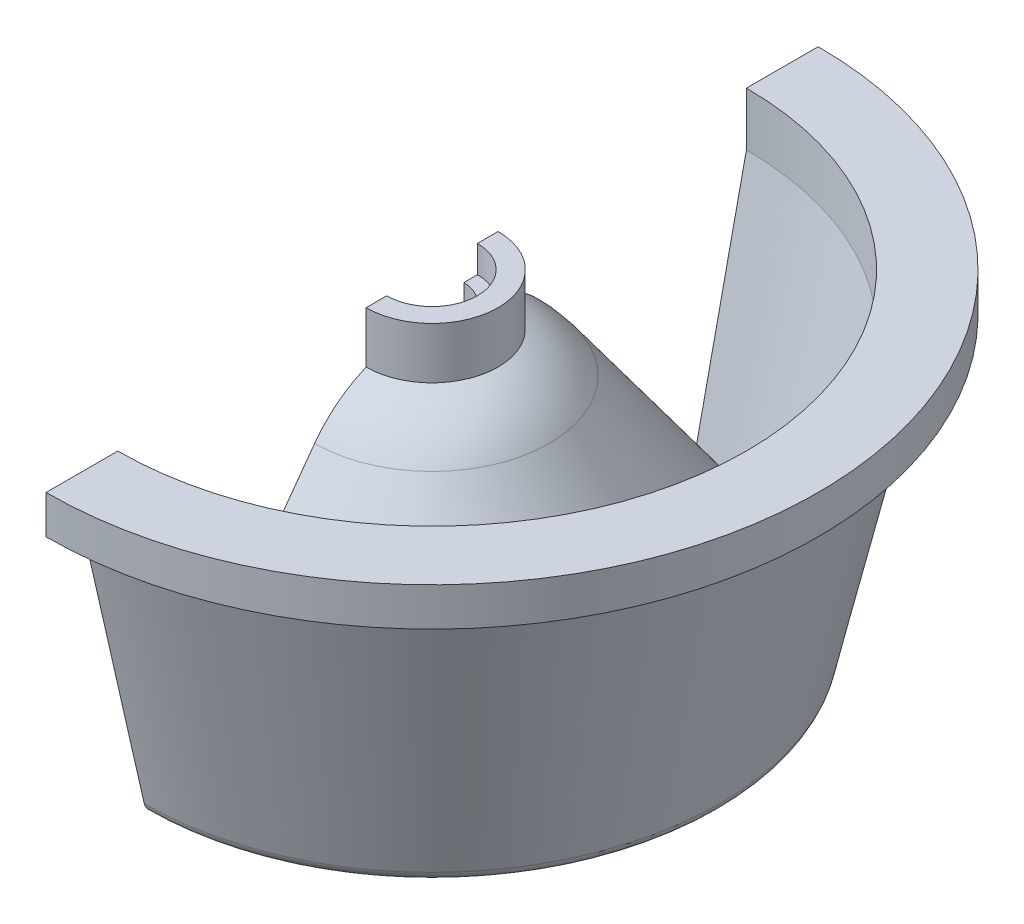
ISO-10303-21;
HEADER;
FILE_DESCRIPTION(('STEP AP214'),'2;1');
FILE_NAME('part.step','',(''),(''),'','','');
FILE_SCHEMA(('AUTOMOTIVE_DESIGN { 1 0 10303 214 1 1 1 1 }'));
ENDSEC;
DATA;
#1=APPLICATION_CONTEXT('core data for automotive mechanical design processes');
#2=APPLICATION_PROTOCOL_DEFINITION('international standard','automotive_design',2000,#1);
#3=PRODUCT_CONTEXT('',#1,'mechanical');
#4=PRODUCT('Part','Part','',(#3));
#5=PRODUCT_RELATED_PRODUCT_CATEGORY('part','',(#4));
#6=PRODUCT_DEFINITION_FORMATION('','',#4);
#7=PRODUCT_DEFINITION_CONTEXT('part definition',#1,'design');
#8=PRODUCT_DEFINITION('design','',#6,#7);
#9=PRODUCT_DEFINITION_SHAPE('','',#8);
#10=(LENGTH_UNIT() NAMED_UNIT(*) SI_UNIT(.MILLI.,.METRE.));
#11=(NAMED_UNIT(*) PLANE_ANGLE_UNIT() SI_UNIT($,.RADIAN.));
#12=(NAMED_UNIT(*) SI_UNIT($,.STERADIAN.) SOLID_ANGLE_UNIT());
#13=UNCERTAINTY_MEASURE_WITH_UNIT(LENGTH_MEASURE(1.E-05),#10,'distance_accuracy_value','');
#14=(GEOMETRIC_REPRESENTATION_CONTEXT(3) GLOBAL_UNCERTAINTY_ASSIGNED_CONTEXT((#13)) GLOBAL_UNIT_ASSIGNED_CONTEXT((#10,
#11,#12)) REPRESENTATION_CONTEXT('',''));
#15=CARTESIAN_POINT('',(0.,0.,0.));
#16=DIRECTION('',(0.,0.,1.));
#17=DIRECTION('',(1.,0.,0.));
#18=AXIS2_PLACEMENT_3D('',#15,#16,#17);
#19=CARTESIAN_POINT('',(0.,0.,0.));
#20=DIRECTION('',(1.,0.,0.));
#21=DIRECTION('',(0.,0.,-1.));
#22=AXIS2_PLACEMENT_3D('',#19,#20,#21);
#23=PLANE('',#22);
#24=DIRECTION('',(0.,0.,1.));
#25=VECTOR('',#24,1.);
#26=CARTESIAN_POINT('',(0.,42.5,-85.203979415));
#27=LINE('',#26,#25);
#28=CARTESIAN_POINT('',(0.,42.5,-14.564274866966));
#29=VERTEX_POINT('',#28);
#30=CARTESIAN_POINT('',(0.,42.5,-10.));
#31=VERTEX_POINT('',#30);
#32=EDGE_CURVE('E177',#29,#31,#27,.T.);
#33=ORIENTED_EDGE('',*,*,#32,.F.);
#34=DIRECTION('',(0.,1.,0.));
#35=VECTOR('',#34,1.);
#36=CARTESIAN_POINT('',(0.,0.,-14.564274866966));
#37=LINE('',#36,#35);
#38=CARTESIAN_POINT('',(0.,31.1469664993675,-14.564274866966));
#39=VERTEX_POINT('',#38);
#40=EDGE_CURVE('E189',#39,#29,#37,.T.);
#41=ORIENTED_EDGE('',*,*,#40,.F.);
#42=CARTESIAN_POINT('',(0.,6.67345768639848,-4.5333456199246));
#43=DIRECTION('',(1.,0.,0.));
#44=DIRECTION('',(0.,0.,-1.));
#45=AXIS2_PLACEMENT_3D('',#42,#43,#44);
#46=CIRCLE('',#45,26.4494267457279);
#47=CARTESIAN_POINT('',(0.,22.235882692982,-25.9198624726543));
#48=VERTEX_POINT('',#47);
#49=EDGE_CURVE('E282',#48,#39,#46,.T.);
#50=ORIENTED_EDGE('',*,*,#49,.F.);
#51=DIRECTION('',(0.,0.808581488677597,0.588384207952526));
#52=VECTOR('',#51,1.);
#53=CARTESIAN_POINT('',(0.,57.8560110057194,0.));
#54=LINE('',#53,#52);
#55=CARTESIAN_POINT('',(0.,-21.8366269513204,-57.9903081143829));
#56=VERTEX_POINT('',#55);
#57=EDGE_CURVE('E276',#56,#48,#54,.T.);
#58=ORIENTED_EDGE('',*,*,#57,.F.);
#59=DIRECTION('',(0.,0.977325455953386,-0.211742657831402));
#60=VECTOR('',#59,1.);
#61=CARTESIAN_POINT('',(0.,-289.498348492069,0.));
#62=LINE('',#61,#60);
#63=CARTESIAN_POINT('',(0.,30.6647699152248,-69.3650095965407));
#64=VERTEX_POINT('',#63);
#65=EDGE_CURVE('E260',#64,#56,#62,.F.);
#66=ORIENTED_EDGE('',*,*,#65,.F.);
#67=DIRECTION('',(0.,1.,0.));
#68=VECTOR('',#67,1.);
#69=CARTESIAN_POINT('',(0.,0.,-69.3650095965407));
#70=LINE('',#69,#68);
#71=CARTESIAN_POINT('',(0.,42.5,-69.3650095965407));
#72=VERTEX_POINT('',#71);
#73=EDGE_CURVE('E259',#72,#64,#70,.F.);
#74=ORIENTED_EDGE('',*,*,#73,.F.);
#75=DIRECTION('',(0.,0.,1.));
#76=VECTOR('',#75,1.);
#77=CARTESIAN_POINT('',(0.,42.5,-85.203979415));
#78=LINE('',#77,#76);
#79=CARTESIAN_POINT('',(0.,42.5,-85.203979415));
#80=VERTEX_POINT('',#79);
#81=EDGE_CURVE('E252',#80,#72,#78,.T.);
#82=ORIENTED_EDGE('',*,*,#81,.F.);
#83=DIRECTION('',(0.,1.,0.));
#84=VECTOR('',#83,1.);
#85=CARTESIAN_POINT('',(0.,42.5,-85.203979415));
#86=LINE('',#85,#84);
#87=CARTESIAN_POINT('',(0.,34.0219145176376,-85.203979415));
#88=VERTEX_POINT('',#87);
#89=EDGE_CURVE('E178',#88,#80,#86,.T.);
#90=ORIENTED_EDGE('',*,*,#89,.F.);
#91=DIRECTION('',(0.,0.,1.));
#92=VECTOR('',#91,1.);
#93=CARTESIAN_POINT('',(0.,34.0219145176376,0.));
#94=LINE('',#93,#92);
#95=CARTESIAN_POINT('',(0.,34.0219145176376,-81.203979415));
#96=VERTEX_POINT('',#95);
#97=EDGE_CURVE('E248',#88,#96,#94,.T.);
#98=ORIENTED_EDGE('',*,*,#97,.T.);
#99=DIRECTION('',(0.,1.,0.));
#100=VECTOR('',#99,1.);
#101=CARTESIAN_POINT('',(0.,0.,-81.203979415));
#102=LINE('',#101,#100);
#103=CARTESIAN_POINT('',(0.,36.5219145176376,-81.203979415));
#104=VERTEX_POINT('',#103);
#105=EDGE_CURVE('E41',#96,#104,#102,.T.);
#106=ORIENTED_EDGE('',*,*,#105,.T.);
#107=DIRECTION('',(0.,0.,1.));
#108=VECTOR('',#107,1.);
#109=CARTESIAN_POINT('',(0.,36.5219145176376,0.));
#110=LINE('',#109,#108);
#111=CARTESIAN_POINT('',(0.,36.5219145176376,-76.8418703494323));
#112=VERTEX_POINT('',#111);
#113=EDGE_CURVE('E49',#104,#112,#110,.T.);
#114=ORIENTED_EDGE('',*,*,#113,.T.);
#115=DIRECTION('',(0.,1.,0.));
#116=VECTOR('',#115,1.);
#117=CARTESIAN_POINT('',(0.,-1.22114086324986,-76.8418703494323));
#118=LINE('',#117,#116);
#119=CARTESIAN_POINT('',(0.,30.6647699152248,-76.8418703494323));
#120=VERTEX_POINT('',#119);
#121=EDGE_CURVE('E263',#120,#112,#118,.T.);
#122=ORIENTED_EDGE('',*,*,#121,.F.);
#123=DIRECTION('',(0.,0.975026435469395,-0.222088833883753));
#124=VECTOR('',#123,1.);
#125=CARTESIAN_POINT('',(0.,-306.690574031625,0.));
#126=LINE('',#125,#124);
#127=CARTESIAN_POINT('',(0.,-27.7913157893171,-63.5269042774811));
#128=VERTEX_POINT('',#127);
#129=EDGE_CURVE('E267',#128,#120,#126,.T.);
#130=ORIENTED_EDGE('',*,*,#129,.F.);
#131=CARTESIAN_POINT('',(0.,-27.1250492876658,-60.6018249710729));
#132=DIRECTION('',(1.,0.,0.));
#133=DIRECTION('',(0.,0.,-1.));
#134=AXIS2_PLACEMENT_3D('',#131,#132,#133);
#135=CIRCLE('',#134,3.00000000000001);
#136=CARTESIAN_POINT('',(0.,-28.8902019115234,-58.1760805050401));
#137=VERTEX_POINT('',#136);
#138=EDGE_CURVE('E251',#137,#128,#135,.T.);
#139=ORIENTED_EDGE('',*,*,#138,.F.);
#140=DIRECTION('',(0.,0.808581488677597,0.588384207952526));
#141=VECTOR('',#140,1.);
#142=CARTESIAN_POINT('',(0.,51.0577320139713,0.));
#143=LINE('',#142,#141);
#144=CARTESIAN_POINT('',(0.,19.8823458611719,-22.6855365179439));
#145=VERTEX_POINT('',#144);
#146=EDGE_CURVE('E274',#145,#137,#143,.F.);
#147=ORIENTED_EDGE('',*,*,#146,.F.);
#148=CARTESIAN_POINT('',(0.,6.67345768639848,-4.53334561992459));
#149=DIRECTION('',(1.,0.,0.));
#150=DIRECTION('',(0.,0.,-1.));
#151=AXIS2_PLACEMENT_3D('',#148,#149,#150);
#152=CIRCLE('',#151,22.4494267457279);
#153=CARTESIAN_POINT('',(0.,28.9869598180912,-7.00000000000001));
#154=VERTEX_POINT('',#153);
#155=EDGE_CURVE('E279',#154,#145,#152,.F.);
#156=ORIENTED_EDGE('',*,*,#155,.F.);
#157=DIRECTION('',(0.,1.,0.));
#158=VECTOR('',#157,1.);
#159=CARTESIAN_POINT('',(0.,-1.22114086324985,-7.));
#160=LINE('',#159,#158);
#161=CARTESIAN_POINT('',(0.,36.5219145176376,-7.00000000000001));
#162=VERTEX_POINT('',#161);
#163=EDGE_CURVE('E280',#162,#154,#160,.F.);
#164=ORIENTED_EDGE('',*,*,#163,.F.);
#165=DIRECTION('',(0.,0.,1.));
#166=VECTOR('',#165,1.);
#167=CARTESIAN_POINT('',(0.,36.5219145176376,0.));
#168=LINE('',#167,#166);
#169=CARTESIAN_POINT('',(0.,36.5219145176376,-10.));
#170=VERTEX_POINT('',#169);
#171=EDGE_CURVE('E284',#170,#162,#168,.T.);
#172=ORIENTED_EDGE('',*,*,#171,.F.);
#173=DIRECTION('',(0.,-1.,0.));
#174=VECTOR('',#173,1.);
#175=CARTESIAN_POINT('',(0.,46.5219145176376,-10.));
#176=LINE('',#175,#174);
#177=EDGE_CURVE('E36',#31,#170,#176,.T.);
#178=ORIENTED_EDGE('',*,*,#177,.F.);
#179=EDGE_LOOP('',(#33,#41,#50,#58,#66,#74,#82,#90,#98,#106,#114,#122,#130,#139,#147,#156,#164,
#172,#178));
#180=FACE_BOUND('',#179,.T.);
#181=ADVANCED_FACE('F33',(#180),#23,.F.);
#182=CARTESIAN_POINT('',(0.,36.5219145176376,7.00000000000001));
#183=VERTEX_POINT('',#182);
#184=CARTESIAN_POINT('',(0.,36.5219145176376,9.99999999999999));
#185=VERTEX_POINT('',#184);
#186=EDGE_CURVE('E286',#183,#185,#168,.T.);
#187=ORIENTED_EDGE('',*,*,#186,.F.);
#188=DIRECTION('',(0.,1.,0.));
#189=VECTOR('',#188,1.);
#190=CARTESIAN_POINT('',(0.,-1.22114086324985,7.00000000000001));
#191=LINE('',#190,#189);
#192=CARTESIAN_POINT('',(0.,28.9869598180912,7.));
#193=VERTEX_POINT('',#192);
#194=EDGE_CURVE('E283',#193,#183,#191,.T.);
#195=ORIENTED_EDGE('',*,*,#194,.F.);
#196=CARTESIAN_POINT('',(0.,6.67345768639848,4.5333456199246));
#197=DIRECTION('',(1.,0.,0.));
#198=DIRECTION('',(0.,0.,-1.));
#199=AXIS2_PLACEMENT_3D('',#196,#197,#198);
#200=CIRCLE('',#199,22.4494267457279);
#201=CARTESIAN_POINT('',(0.,19.8823458611719,22.6855365179439));
#202=VERTEX_POINT('',#201);
#203=EDGE_CURVE('E277',#202,#193,#200,.F.);
#204=ORIENTED_EDGE('',*,*,#203,.F.);
#205=DIRECTION('',(0.,-0.808581488677597,0.588384207952526));
#206=VECTOR('',#205,1.);
#207=CARTESIAN_POINT('',(0.,51.0577320139713,0.));
#208=LINE('',#207,#206);
#209=CARTESIAN_POINT('',(0.,-28.8902019115234,58.1760805050401));
#210=VERTEX_POINT('',#209);
#211=EDGE_CURVE('E264',#210,#202,#208,.F.);
#212=ORIENTED_EDGE('',*,*,#211,.F.);
#213=CARTESIAN_POINT('',(0.,-27.1250492876658,60.601824971073));
#214=DIRECTION('',(1.,0.,0.));
#215=DIRECTION('',(0.,0.,-1.));
#216=AXIS2_PLACEMENT_3D('',#213,#214,#215);
#217=CIRCLE('',#216,3.00000000000001);
#218=CARTESIAN_POINT('',(0.,-27.791315789317,63.5269042774812));
#219=VERTEX_POINT('',#218);
#220=EDGE_CURVE('E268',#219,#210,#217,.T.);
#221=ORIENTED_EDGE('',*,*,#220,.F.);
#222=DIRECTION('',(0.,-0.975026435469395,-0.222088833883753));
#223=VECTOR('',#222,1.);
#224=CARTESIAN_POINT('',(0.,-306.690574031625,0.));
#225=LINE('',#224,#223);
#226=CARTESIAN_POINT('',(0.,30.6647699152249,76.8418703494323));
#227=VERTEX_POINT('',#226);
#228=EDGE_CURVE('E265',#227,#219,#225,.T.);
#229=ORIENTED_EDGE('',*,*,#228,.F.);
#230=DIRECTION('',(0.,1.,0.));
#231=VECTOR('',#230,1.);
#232=CARTESIAN_POINT('',(0.,-1.22114086324983,76.8418703494323));
#233=LINE('',#232,#231);
#234=CARTESIAN_POINT('',(0.,36.5219145176376,76.8418703494323));
#235=VERTEX_POINT('',#234);
#236=EDGE_CURVE('E261',#235,#227,#233,.F.);
#237=ORIENTED_EDGE('',*,*,#236,.F.);
#238=CARTESIAN_POINT('',(0.,36.5219145176376,81.203979415));
#239=VERTEX_POINT('',#238);
#240=EDGE_CURVE('E255',#235,#239,#110,.T.);
#241=ORIENTED_EDGE('',*,*,#240,.T.);
#242=DIRECTION('',(0.,1.,0.));
#243=VECTOR('',#242,1.);
#244=CARTESIAN_POINT('',(0.,0.,81.203979415));
#245=LINE('',#244,#243);
#246=CARTESIAN_POINT('',(0.,34.0219145176376,81.203979415));
#247=VERTEX_POINT('',#246);
#248=EDGE_CURVE('E11',#239,#247,#245,.F.);
#249=ORIENTED_EDGE('',*,*,#248,.T.);
#250=CARTESIAN_POINT('',(0.,34.0219145176376,85.203979415));
#251=VERTEX_POINT('',#250);
#252=EDGE_CURVE('E245',#247,#251,#94,.T.);
#253=ORIENTED_EDGE('',*,*,#252,.T.);
#254=DIRECTION('',(0.,1.,0.));
#255=VECTOR('',#254,1.);
#256=CARTESIAN_POINT('',(0.,42.5,85.203979415));
#257=LINE('',#256,#255);
#258=CARTESIAN_POINT('',(0.,42.5,85.203979415));
#259=VERTEX_POINT('',#258);
#260=EDGE_CURVE('E249',#259,#251,#257,.F.);
#261=ORIENTED_EDGE('',*,*,#260,.F.);
#262=CARTESIAN_POINT('',(0.,42.5,69.3650095965407));
#263=VERTEX_POINT('',#262);
#264=EDGE_CURVE('E254',#263,#259,#78,.T.);
#265=ORIENTED_EDGE('',*,*,#264,.F.);
#266=DIRECTION('',(0.,1.,0.));
#267=VECTOR('',#266,1.);
#268=CARTESIAN_POINT('',(0.,0.,69.3650095965407));
#269=LINE('',#268,#267);
#270=CARTESIAN_POINT('',(0.,30.6647699152248,69.3650095965407));
#271=VERTEX_POINT('',#270);
#272=EDGE_CURVE('E257',#271,#263,#269,.T.);
#273=ORIENTED_EDGE('',*,*,#272,.F.);
#274=DIRECTION('',(0.,-0.977325455953386,-0.211742657831402));
#275=VECTOR('',#274,1.);
#276=CARTESIAN_POINT('',(0.,-289.498348492069,0.));
#277=LINE('',#276,#275);
#278=CARTESIAN_POINT('',(0.,-21.8366269513204,57.9903081143829));
#279=VERTEX_POINT('',#278);
#280=EDGE_CURVE('E270',#279,#271,#277,.F.);
#281=ORIENTED_EDGE('',*,*,#280,.F.);
#282=DIRECTION('',(0.,-0.808581488677597,0.588384207952526));
#283=VECTOR('',#282,1.);
#284=CARTESIAN_POINT('',(0.,57.8560110057194,0.));
#285=LINE('',#284,#283);
#286=CARTESIAN_POINT('',(0.,22.235882692982,25.9198624726543));
#287=VERTEX_POINT('',#286);
#288=EDGE_CURVE('E272',#287,#279,#285,.T.);
#289=ORIENTED_EDGE('',*,*,#288,.F.);
#290=CARTESIAN_POINT('',(0.,6.67345768639848,4.5333456199246));
#291=DIRECTION('',(1.,0.,0.));
#292=DIRECTION('',(0.,0.,-1.));
#293=AXIS2_PLACEMENT_3D('',#290,#291,#292);
#294=CIRCLE('',#293,26.4494267457279);
#295=CARTESIAN_POINT('',(0.,31.1469664993675,14.564274866966));
#296=VERTEX_POINT('',#295);
#297=EDGE_CURVE('E185',#296,#287,#294,.T.);
#298=ORIENTED_EDGE('',*,*,#297,.F.);
#299=DIRECTION('',(0.,1.,0.));
#300=VECTOR('',#299,1.);
#301=CARTESIAN_POINT('',(0.,0.,14.564274866966));
#302=LINE('',#301,#300);
#303=CARTESIAN_POINT('',(0.,42.5,14.564274866966));
#304=VERTEX_POINT('',#303);
#305=EDGE_CURVE('E181',#304,#296,#302,.F.);
#306=ORIENTED_EDGE('',*,*,#305,.F.);
#307=CARTESIAN_POINT('',(0.,42.5,9.99999999999999));
#308=VERTEX_POINT('',#307);
#309=EDGE_CURVE('E168',#308,#304,#27,.T.);
#310=ORIENTED_EDGE('',*,*,#309,.F.);
#311=DIRECTION('',(0.,-1.,0.));
#312=VECTOR('',#311,1.);
#313=CARTESIAN_POINT('',(0.,46.5219145176376,9.99999999999999));
#314=LINE('',#313,#312);
#315=EDGE_CURVE('E288',#185,#308,#314,.F.);
#316=ORIENTED_EDGE('',*,*,#315,.F.);
#317=EDGE_LOOP('',(#187,#195,#204,#212,#221,#229,#237,#241,#249,#253,#261,#265,#273,#281,#289,
#298,#306,#310,#316));
#318=FACE_BOUND('',#317,.T.);
#319=ADVANCED_FACE('F183',(#318),#23,.F.);
#320=CARTESIAN_POINT('',(0.,36.5219145176376,0.));
#321=DIRECTION('',(0.,-1.,0.));
#322=DIRECTION('',(0.,0.,-1.));
#323=AXIS2_PLACEMENT_3D('',#320,#321,#322);
#324=PLANE('',#323);
#325=ORIENTED_EDGE('',*,*,#113,.F.);
#326=CARTESIAN_POINT('',(0.,36.5219145176376,0.));
#327=DIRECTION('',(0.,-1.,0.));
#328=DIRECTION('',(0.,0.,-1.));
#329=AXIS2_PLACEMENT_3D('',#326,#327,#328);
#330=CIRCLE('',#329,81.203979415);
#331=EDGE_CURVE('E190',#239,#104,#330,.F.);
#332=ORIENTED_EDGE('',*,*,#331,.F.);
#333=ORIENTED_EDGE('',*,*,#240,.F.);
#334=CARTESIAN_POINT('',(0.,36.5219145176376,0.));
#335=DIRECTION('',(0.,1.,0.));
#336=DIRECTION('',(-0.010442725131449,0.,0.999945473259332));
#337=AXIS2_PLACEMENT_3D('',#334,#335,#336);
#338=CIRCLE('',#337,76.8418703494323);
#339=EDGE_CURVE('E223',#235,#112,#338,.T.);
#340=ORIENTED_EDGE('',*,*,#339,.T.);
#341=EDGE_LOOP('',(#325,#332,#333,#340));
#342=FACE_BOUND('',#341,.T.);
#343=ADVANCED_FACE('F339',(#342),#324,.T.);
#344=CARTESIAN_POINT('',(0.,42.5,-85.203979415));
#345=DIRECTION('',(0.,-1.,0.));
#346=DIRECTION('',(0.,0.,-1.));
#347=AXIS2_PLACEMENT_3D('',#344,#345,#346);
#348=PLANE('',#347);
#349=CARTESIAN_POINT('',(0.,42.5,0.));
#350=DIRECTION('',(0.,1.,0.));
#351=DIRECTION('',(0.,0.,1.));
#352=AXIS2_PLACEMENT_3D('',#349,#350,#351);
#353=CIRCLE('',#352,85.203979415);
#354=EDGE_CURVE('E235',#259,#80,#353,.T.);
#355=ORIENTED_EDGE('',*,*,#354,.T.);
#356=ORIENTED_EDGE('',*,*,#81,.T.);
#357=CARTESIAN_POINT('',(0.,42.5,0.));
#358=DIRECTION('',(0.,1.,0.));
#359=DIRECTION('',(0.,0.,1.));
#360=AXIS2_PLACEMENT_3D('',#357,#358,#359);
#361=CIRCLE('',#360,69.3650095965407);
#362=EDGE_CURVE('E213',#263,#72,#361,.T.);
#363=ORIENTED_EDGE('',*,*,#362,.F.);
#364=ORIENTED_EDGE('',*,*,#264,.T.);
#365=EDGE_LOOP('',(#355,#356,#363,#364));
#366=FACE_BOUND('',#365,.T.);
#367=ADVANCED_FACE('F344',(#366),#348,.F.);
#368=CARTESIAN_POINT('',(0.,42.5,0.));
#369=DIRECTION('',(0.,1.,0.));
#370=DIRECTION('',(0.,0.,1.));
#371=AXIS2_PLACEMENT_3D('',#368,#369,#370);
#372=CIRCLE('',#371,14.564274866966);
#373=EDGE_CURVE('E173',#304,#29,#372,.T.);
#374=ORIENTED_EDGE('',*,*,#373,.T.);
#375=ORIENTED_EDGE('',*,*,#32,.T.);
#376=CARTESIAN_POINT('',(0.,42.5,0.));
#377=DIRECTION('',(0.,-1.,0.));
#378=DIRECTION('',(0.,0.,-1.));
#379=AXIS2_PLACEMENT_3D('',#376,#377,#378);
#380=CIRCLE('',#379,10.);
#381=EDGE_CURVE('E175',#31,#308,#380,.T.);
#382=ORIENTED_EDGE('',*,*,#381,.T.);
#383=ORIENTED_EDGE('',*,*,#309,.T.);
#384=EDGE_LOOP('',(#374,#375,#382,#383));
#385=FACE_BOUND('',#384,.T.);
#386=ADVANCED_FACE('F170',(#385),#348,.F.);
#387=CARTESIAN_POINT('',(0.,42.5,0.));
#388=DIRECTION('',(0.,1.,0.));
#389=DIRECTION('',(0.,0.,1.));
#390=AXIS2_PLACEMENT_3D('',#387,#388,#389);
#391=CYLINDRICAL_SURFACE('',#390,85.203979415);
#392=CARTESIAN_POINT('',(0.,34.0219145176376,0.));
#393=DIRECTION('',(0.,1.,0.));
#394=DIRECTION('',(0.,0.,1.));
#395=AXIS2_PLACEMENT_3D('',#392,#393,#394);
#396=CIRCLE('',#395,85.203979415);
#397=EDGE_CURVE('E196',#251,#88,#396,.T.);
#398=ORIENTED_EDGE('',*,*,#397,.T.);
#399=ORIENTED_EDGE('',*,*,#89,.T.);
#400=ORIENTED_EDGE('',*,*,#354,.F.);
#401=ORIENTED_EDGE('',*,*,#260,.T.);
#402=EDGE_LOOP('',(#398,#399,#400,#401));
#403=FACE_BOUND('',#402,.T.);
#404=ADVANCED_FACE('F389',(#403),#391,.T.);
#405=CARTESIAN_POINT('',(0.,-27.1250492876658,0.));
#406=DIRECTION('',(0.,1.,0.));
#407=DIRECTION('',(-0.010442725131449,0.,0.999945473259332));
#408=AXIS2_PLACEMENT_3D('',#405,#406,#407);
#409=TOROIDAL_SURFACE('',#408,60.6018249710729,3.00000000000001);
#410=CARTESIAN_POINT('',(0.,-28.8902019115234,0.));
#411=DIRECTION('',(0.,1.,0.));
#412=DIRECTION('',(-0.010442725131449,0.,0.999945473259332));
#413=AXIS2_PLACEMENT_3D('',#410,#411,#412);
#414=CIRCLE('',#413,58.1760805050401);
#415=EDGE_CURVE('E226',#210,#137,#414,.T.);
#416=ORIENTED_EDGE('',*,*,#415,.T.);
#417=ORIENTED_EDGE('',*,*,#138,.T.);
#418=CARTESIAN_POINT('',(0.,-27.791315789317,0.));
#419=DIRECTION('',(0.,1.,0.));
#420=DIRECTION('',(-0.010442725131449,0.,0.999945473259332));
#421=AXIS2_PLACEMENT_3D('',#418,#419,#420);
#422=CIRCLE('',#421,63.5269042774811);
#423=EDGE_CURVE('E222',#219,#128,#422,.T.);
#424=ORIENTED_EDGE('',*,*,#423,.F.);
#425=ORIENTED_EDGE('',*,*,#220,.T.);
#426=EDGE_LOOP('',(#416,#417,#424,#425));
#427=FACE_BOUND('',#426,.T.);
#428=ADVANCED_FACE('F404',(#427),#409,.T.);
#429=CARTESIAN_POINT('',(0.,-27.791315789317,0.));
#430=DIRECTION('',(0.,1.,0.));
#431=DIRECTION('',(-0.010442725131449,0.,0.999945473259332));
#432=AXIS2_PLACEMENT_3D('',#429,#430,#431);
#433=CONICAL_SURFACE('',#432,63.5269042774811,0.223956285326343);
#434=ORIENTED_EDGE('',*,*,#423,.T.);
#435=ORIENTED_EDGE('',*,*,#129,.T.);
#436=CARTESIAN_POINT('',(0.,30.6647699152248,0.));
#437=DIRECTION('',(0.,1.,0.));
#438=DIRECTION('',(-0.010442725131449,0.,0.999945473259332));
#439=AXIS2_PLACEMENT_3D('',#436,#437,#438);
#440=CIRCLE('',#439,76.8418703494323);
#441=EDGE_CURVE('E219',#227,#120,#440,.T.);
#442=ORIENTED_EDGE('',*,*,#441,.F.);
#443=ORIENTED_EDGE('',*,*,#228,.T.);
#444=EDGE_LOOP('',(#434,#435,#442,#443));
#445=FACE_BOUND('',#444,.T.);
#446=ADVANCED_FACE('F399',(#445),#433,.T.);
#447=CARTESIAN_POINT('',(0.,-1.22114086324985,0.));
#448=DIRECTION('',(0.,1.,0.));
#449=DIRECTION('',(-0.010442725131449,0.,0.999945473259332));
#450=AXIS2_PLACEMENT_3D('',#447,#448,#449);
#451=CYLINDRICAL_SURFACE('',#450,76.8418703494323);
#452=ORIENTED_EDGE('',*,*,#441,.T.);
#453=ORIENTED_EDGE('',*,*,#121,.T.);
#454=ORIENTED_EDGE('',*,*,#339,.F.);
#455=ORIENTED_EDGE('',*,*,#236,.T.);
#456=EDGE_LOOP('',(#452,#453,#454,#455));
#457=FACE_BOUND('',#456,.T.);
#458=ADVANCED_FACE('F395',(#457),#451,.T.);
#459=CARTESIAN_POINT('',(0.,19.8823458611719,0.));
#460=DIRECTION('',(0.,-1.,0.));
#461=DIRECTION('',(0.010442725131449,0.,-0.999945473259332));
#462=AXIS2_PLACEMENT_3D('',#459,#460,#461);
#463=CONICAL_SURFACE('',#462,22.6855365179439,0.629059079919699);
#464=ORIENTED_EDGE('',*,*,#415,.F.);
#465=ORIENTED_EDGE('',*,*,#211,.T.);
#466=CARTESIAN_POINT('',(0.,19.8823458611719,0.));
#467=DIRECTION('',(0.,1.,0.));
#468=DIRECTION('',(-0.010442725131449,0.,0.999945473259332));
#469=AXIS2_PLACEMENT_3D('',#466,#467,#468);
#470=CIRCLE('',#469,22.6855365179439);
#471=EDGE_CURVE('E229',#202,#145,#470,.T.);
#472=ORIENTED_EDGE('',*,*,#471,.T.);
#473=ORIENTED_EDGE('',*,*,#146,.T.);
#474=EDGE_LOOP('',(#464,#465,#472,#473));
#475=FACE_BOUND('',#474,.T.);
#476=ADVANCED_FACE('F406',(#475),#463,.F.);
#477=CARTESIAN_POINT('',(0.,6.67345768639848,0.));
#478=DIRECTION('',(0.,1.,0.));
#479=DIRECTION('',(-0.010442725131449,0.,0.999945473259332));
#480=AXIS2_PLACEMENT_3D('',#477,#478,#479);
#481=DEGENERATE_TOROIDAL_SURFACE('',#480,4.5333456199246,22.4494267457279,.T.);
#482=CARTESIAN_POINT('',(0.,28.9869598180912,0.));
#483=DIRECTION('',(0.,1.,0.));
#484=DIRECTION('',(-0.010442725131449,0.,0.999945473259332));
#485=AXIS2_PLACEMENT_3D('',#482,#483,#484);
#486=CIRCLE('',#485,7.);
#487=EDGE_CURVE('E232',#193,#154,#486,.T.);
#488=ORIENTED_EDGE('',*,*,#487,.T.);
#489=ORIENTED_EDGE('',*,*,#155,.T.);
#490=ORIENTED_EDGE('',*,*,#471,.F.);
#491=ORIENTED_EDGE('',*,*,#203,.T.);
#492=EDGE_LOOP('',(#488,#489,#490,#491));
#493=FACE_BOUND('',#492,.T.);
#494=ADVANCED_FACE('F312',(#493),#481,.F.);
#495=CARTESIAN_POINT('',(0.,-1.22114086324985,0.));
#496=DIRECTION('',(0.,1.,0.));
#497=DIRECTION('',(-0.010442725131449,0.,0.999945473259332));
#498=AXIS2_PLACEMENT_3D('',#495,#496,#497);
#499=CYLINDRICAL_SURFACE('',#498,7.00000000000001);
#500=CARTESIAN_POINT('',(0.,36.5219145176376,0.));
#501=DIRECTION('',(0.,1.,0.));
#502=DIRECTION('',(-0.010442725131449,0.,0.999945473259332));
#503=AXIS2_PLACEMENT_3D('',#500,#501,#502);
#504=CIRCLE('',#503,7.00000000000001);
#505=EDGE_CURVE('E237',#183,#162,#504,.T.);
#506=ORIENTED_EDGE('',*,*,#505,.T.);
#507=ORIENTED_EDGE('',*,*,#163,.T.);
#508=ORIENTED_EDGE('',*,*,#487,.F.);
#509=ORIENTED_EDGE('',*,*,#194,.T.);
#510=EDGE_LOOP('',(#506,#507,#508,#509));
#511=FACE_BOUND('',#510,.T.);
#512=ADVANCED_FACE('F304',(#511),#499,.F.);
#513=CARTESIAN_POINT('',(0.,36.5219145176376,0.));
#514=DIRECTION('',(0.,-1.,0.));
#515=DIRECTION('',(0.,0.,-1.));
#516=AXIS2_PLACEMENT_3D('',#513,#514,#515);
#517=PLANE('',#516);
#518=CARTESIAN_POINT('',(0.,36.5219145176376,0.));
#519=DIRECTION('',(0.,-1.,0.));
#520=DIRECTION('',(0.,0.,-1.));
#521=AXIS2_PLACEMENT_3D('',#518,#519,#520);
#522=CIRCLE('',#521,10.);
#523=EDGE_CURVE('E216',#170,#185,#522,.T.);
#524=ORIENTED_EDGE('',*,*,#523,.F.);
#525=ORIENTED_EDGE('',*,*,#171,.T.);
#526=ORIENTED_EDGE('',*,*,#505,.F.);
#527=ORIENTED_EDGE('',*,*,#186,.T.);
#528=EDGE_LOOP('',(#524,#525,#526,#527));
#529=FACE_BOUND('',#528,.T.);
#530=ADVANCED_FACE('F319',(#529),#517,.F.);
#531=CARTESIAN_POINT('',(0.,46.5219145176376,0.));
#532=DIRECTION('',(0.,-1.,0.));
#533=DIRECTION('',(0.,0.,-1.));
#534=AXIS2_PLACEMENT_3D('',#531,#532,#533);
#535=CYLINDRICAL_SURFACE('',#534,10.);
#536=ORIENTED_EDGE('',*,*,#523,.T.);
#537=ORIENTED_EDGE('',*,*,#315,.T.);
#538=ORIENTED_EDGE('',*,*,#381,.F.);
#539=ORIENTED_EDGE('',*,*,#177,.T.);
#540=EDGE_LOOP('',(#536,#537,#538,#539));
#541=FACE_BOUND('',#540,.T.);
#542=ADVANCED_FACE('F321',(#541),#535,.F.);
#543=CARTESIAN_POINT('',(0.,0.,0.));
#544=DIRECTION('',(0.,1.,0.));
#545=DIRECTION('',(0.,0.,1.));
#546=AXIS2_PLACEMENT_3D('',#543,#544,#545);
#547=CYLINDRICAL_SURFACE('',#546,69.3650095965407);
#548=ORIENTED_EDGE('',*,*,#362,.T.);
#549=ORIENTED_EDGE('',*,*,#73,.T.);
#550=CARTESIAN_POINT('',(0.,30.6647699152248,0.));
#551=DIRECTION('',(0.,1.,0.));
#552=DIRECTION('',(0.,0.,1.));
#553=AXIS2_PLACEMENT_3D('',#550,#551,#552);
#554=CIRCLE('',#553,69.3650095965407);
#555=EDGE_CURVE('E210',#271,#64,#554,.T.);
#556=ORIENTED_EDGE('',*,*,#555,.F.);
#557=ORIENTED_EDGE('',*,*,#272,.T.);
#558=EDGE_LOOP('',(#548,#549,#556,#557));
#559=FACE_BOUND('',#558,.T.);
#560=ADVANCED_FACE('F323',(#559),#547,.F.);
#561=CARTESIAN_POINT('',(0.,30.6647699152248,0.));
#562=DIRECTION('',(0.,1.,0.));
#563=DIRECTION('',(0.,0.,1.));
#564=AXIS2_PLACEMENT_3D('',#561,#562,#563);
#565=CONICAL_SURFACE('',#564,69.3650095965407,0.213357704969108);
#566=ORIENTED_EDGE('',*,*,#555,.T.);
#567=ORIENTED_EDGE('',*,*,#65,.T.);
#568=CARTESIAN_POINT('',(0.,-21.8366269513204,0.));
#569=DIRECTION('',(0.,1.,0.));
#570=DIRECTION('',(0.,0.,1.));
#571=AXIS2_PLACEMENT_3D('',#568,#569,#570);
#572=CIRCLE('',#571,57.9903081143829);
#573=EDGE_CURVE('E207',#279,#56,#572,.T.);
#574=ORIENTED_EDGE('',*,*,#573,.F.);
#575=ORIENTED_EDGE('',*,*,#280,.T.);
#576=EDGE_LOOP('',(#566,#567,#574,#575));
#577=FACE_BOUND('',#576,.T.);
#578=ADVANCED_FACE('F329',(#577),#565,.F.);
#579=CARTESIAN_POINT('',(0.,-21.8366269513204,0.));
#580=DIRECTION('',(0.,-1.,0.));
#581=DIRECTION('',(0.,0.,-1.));
#582=AXIS2_PLACEMENT_3D('',#579,#580,#581);
#583=CONICAL_SURFACE('',#582,57.9903081143829,0.629059079919698);
#584=CARTESIAN_POINT('',(0.,22.235882692982,0.));
#585=DIRECTION('',(0.,1.,0.));
#586=DIRECTION('',(0.,0.,1.));
#587=AXIS2_PLACEMENT_3D('',#584,#585,#586);
#588=CIRCLE('',#587,25.9198624726542);
#589=EDGE_CURVE('E198',#287,#48,#588,.T.);
#590=ORIENTED_EDGE('',*,*,#589,.F.);
#591=ORIENTED_EDGE('',*,*,#288,.T.);
#592=ORIENTED_EDGE('',*,*,#573,.T.);
#593=ORIENTED_EDGE('',*,*,#57,.T.);
#594=EDGE_LOOP('',(#590,#591,#592,#593));
#595=FACE_BOUND('',#594,.T.);
#596=ADVANCED_FACE('F360',(#595),#583,.T.);
#597=CARTESIAN_POINT('',(0.,6.67345768639848,0.));
#598=DIRECTION('',(0.,1.,0.));
#599=DIRECTION('',(0.,0.,1.));
#600=AXIS2_PLACEMENT_3D('',#597,#598,#599);
#601=DEGENERATE_TOROIDAL_SURFACE('',#600,4.5333456199246,26.4494267457279,.T.);
#602=ORIENTED_EDGE('',*,*,#589,.T.);
#603=ORIENTED_EDGE('',*,*,#49,.T.);
#604=CARTESIAN_POINT('',(0.,31.1469664993675,0.));
#605=DIRECTION('',(0.,1.,0.));
#606=DIRECTION('',(0.,0.,1.));
#607=AXIS2_PLACEMENT_3D('',#604,#605,#606);
#608=CIRCLE('',#607,14.564274866966);
#609=EDGE_CURVE('E195',#296,#39,#608,.T.);
#610=ORIENTED_EDGE('',*,*,#609,.F.);
#611=ORIENTED_EDGE('',*,*,#297,.T.);
#612=EDGE_LOOP('',(#602,#603,#610,#611));
#613=FACE_BOUND('',#612,.T.);
#614=ADVANCED_FACE('F357',(#613),#601,.T.);
#615=CARTESIAN_POINT('',(0.,0.,0.));
#616=DIRECTION('',(0.,1.,0.));
#617=DIRECTION('',(0.,0.,1.));
#618=AXIS2_PLACEMENT_3D('',#615,#616,#617);
#619=CYLINDRICAL_SURFACE('',#618,14.564274866966);
#620=ORIENTED_EDGE('',*,*,#609,.T.);
#621=ORIENTED_EDGE('',*,*,#40,.T.);
#622=ORIENTED_EDGE('',*,*,#373,.F.);
#623=ORIENTED_EDGE('',*,*,#305,.T.);
#624=EDGE_LOOP('',(#620,#621,#622,#623));
#625=FACE_BOUND('',#624,.T.);
#626=ADVANCED_FACE('F192',(#625),#619,.T.);
#627=CARTESIAN_POINT('',(-85.203979415,34.0219145176376,0.));
#628=DIRECTION('',(0.,-1.,0.));
#629=DIRECTION('',(0.,0.,-1.));
#630=AXIS2_PLACEMENT_3D('',#627,#628,#629);
#631=PLANE('',#630);
#632=ORIENTED_EDGE('',*,*,#97,.F.);
#633=ORIENTED_EDGE('',*,*,#397,.F.);
#634=ORIENTED_EDGE('',*,*,#252,.F.);
#635=CARTESIAN_POINT('',(0.,34.0219145176376,0.));
#636=DIRECTION('',(0.,1.,0.));
#637=DIRECTION('',(0.,0.,1.));
#638=AXIS2_PLACEMENT_3D('',#635,#636,#637);
#639=CIRCLE('',#638,81.203979415);
#640=EDGE_CURVE('E201',#247,#96,#639,.T.);
#641=ORIENTED_EDGE('',*,*,#640,.T.);
#642=EDGE_LOOP('',(#632,#633,#634,#641));
#643=FACE_BOUND('',#642,.T.);
#644=ADVANCED_FACE('F347',(#643),#631,.T.);
#645=CARTESIAN_POINT('',(0.,0.,0.));
#646=DIRECTION('',(0.,1.,0.));
#647=DIRECTION('',(0.,0.,1.));
#648=AXIS2_PLACEMENT_3D('',#645,#646,#647);
#649=CYLINDRICAL_SURFACE('',#648,81.203979415);
#650=ORIENTED_EDGE('',*,*,#105,.F.);
#651=ORIENTED_EDGE('',*,*,#640,.F.);
#652=ORIENTED_EDGE('',*,*,#248,.F.);
#653=ORIENTED_EDGE('',*,*,#331,.T.);
#654=EDGE_LOOP('',(#650,#651,#652,#653));
#655=FACE_BOUND('',#654,.T.);
#656=ADVANCED_FACE('F340',(#655),#649,.F.);
#657=CLOSED_SHELL('',(#181,#319,#343,#367,#386,#404,#428,#446,#458,#476,#494,#512,#530,#542,
#560,#578,#596,#614,#626,#644,#656));
#658=MANIFOLD_SOLID_BREP('B2',#657);
#659=ADVANCED_BREP_SHAPE_REPRESENTATION('',(#18,#658),#14);
#660=SHAPE_DEFINITION_REPRESENTATION(#9,#659);
ENDSEC;
END-ISO-10303-21;
